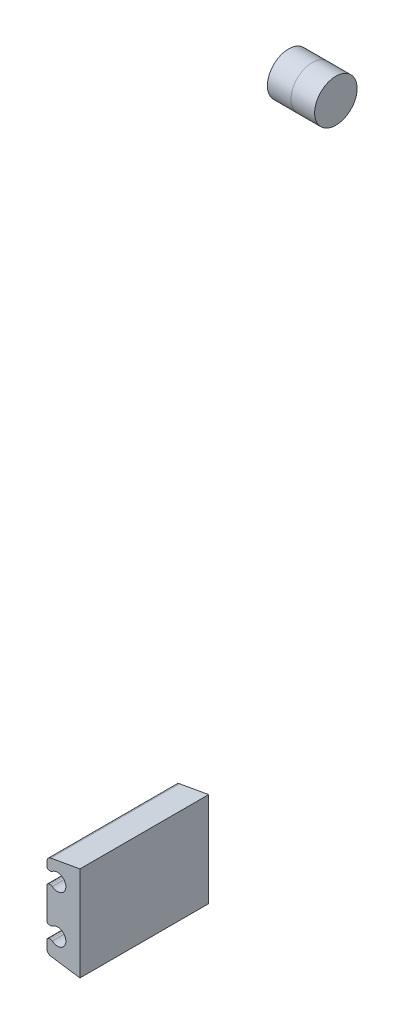
ISO-10303-21;
HEADER;
FILE_DESCRIPTION(('STEP AP214'),'2;1');
FILE_NAME('part.step','',(''),(''),'','','');
FILE_SCHEMA(('AUTOMOTIVE_DESIGN { 1 0 10303 214 1 1 1 1 }'));
ENDSEC;
DATA;
#1=APPLICATION_CONTEXT('core data for automotive mechanical design processes');
#2=APPLICATION_PROTOCOL_DEFINITION('international standard','automotive_design',2000,#1);
#3=PRODUCT_CONTEXT('',#1,'mechanical');
#4=PRODUCT('Part','Part','',(#3));
#5=PRODUCT_RELATED_PRODUCT_CATEGORY('part','',(#4));
#6=PRODUCT_DEFINITION_FORMATION('','',#4);
#7=PRODUCT_DEFINITION_CONTEXT('part definition',#1,'design');
#8=PRODUCT_DEFINITION('design','',#6,#7);
#9=PRODUCT_DEFINITION_SHAPE('','',#8);
#10=(LENGTH_UNIT() NAMED_UNIT(*) SI_UNIT(.MILLI.,.METRE.));
#11=(NAMED_UNIT(*) PLANE_ANGLE_UNIT() SI_UNIT($,.RADIAN.));
#12=(NAMED_UNIT(*) SI_UNIT($,.STERADIAN.) SOLID_ANGLE_UNIT());
#13=UNCERTAINTY_MEASURE_WITH_UNIT(LENGTH_MEASURE(1.E-05),#10,'distance_accuracy_value','');
#14=(GEOMETRIC_REPRESENTATION_CONTEXT(3) GLOBAL_UNCERTAINTY_ASSIGNED_CONTEXT((#13)) GLOBAL_UNIT_ASSIGNED_CONTEXT((#10,
#11,#12)) REPRESENTATION_CONTEXT('',''));
#15=CARTESIAN_POINT('',(0.,0.,0.));
#16=DIRECTION('',(0.,0.,1.));
#17=DIRECTION('',(1.,0.,0.));
#18=AXIS2_PLACEMENT_3D('',#15,#16,#17);
#19=CARTESIAN_POINT('',(29.25,13.,-16.65));
#20=DIRECTION('',(1.,0.,0.));
#21=DIRECTION('',(0.,0.,-1.));
#22=AXIS2_PLACEMENT_3D('',#19,#20,#21);
#23=PLANE('',#22);
#24=CARTESIAN_POINT('',(29.25,13.,-16.65));
#25=DIRECTION('',(1.,0.,0.));
#26=DIRECTION('',(0.,0.,-1.));
#27=AXIS2_PLACEMENT_3D('',#24,#25,#26);
#28=CIRCLE('',#27,4.5);
#29=CARTESIAN_POINT('',(29.25,13.,-21.15));
#30=VERTEX_POINT('',#29);
#31=EDGE_CURVE('E11',#30,#30,#28,.T.);
#32=ORIENTED_EDGE('',*,*,#31,.T.);
#33=EDGE_LOOP('',(#32));
#34=FACE_BOUND('',#33,.T.);
#35=CARTESIAN_POINT('',(29.25,13.,-16.65));
#36=DIRECTION('',(1.,0.,0.));
#37=DIRECTION('',(0.,0.,-1.));
#38=AXIS2_PLACEMENT_3D('',#35,#36,#37);
#39=CIRCLE('',#38,4.);
#40=CARTESIAN_POINT('',(29.25,13.,-20.65));
#41=VERTEX_POINT('',#40);
#42=EDGE_CURVE('E55',#41,#41,#39,.T.);
#43=ORIENTED_EDGE('',*,*,#42,.F.);
#44=EDGE_LOOP('',(#43));
#45=FACE_BOUND('',#44,.T.);
#46=ADVANCED_FACE('F44',(#34,#45),#23,.T.);
#47=CARTESIAN_POINT('',(24.25,13.,-16.65));
#48=DIRECTION('',(1.,0.,0.));
#49=DIRECTION('',(0.,0.,-1.));
#50=AXIS2_PLACEMENT_3D('',#47,#48,#49);
#51=PLANE('',#50);
#52=CARTESIAN_POINT('',(24.25,13.,-16.65));
#53=DIRECTION('',(1.,0.,0.));
#54=DIRECTION('',(0.,0.,-1.));
#55=AXIS2_PLACEMENT_3D('',#52,#53,#54);
#56=CIRCLE('',#55,4.5);
#57=CARTESIAN_POINT('',(24.25,13.,-21.15));
#58=VERTEX_POINT('',#57);
#59=EDGE_CURVE('E48',#58,#58,#56,.T.);
#60=ORIENTED_EDGE('',*,*,#59,.F.);
#61=EDGE_LOOP('',(#60));
#62=FACE_BOUND('',#61,.T.);
#63=CARTESIAN_POINT('',(24.25,13.,-16.65));
#64=DIRECTION('',(1.,0.,0.));
#65=DIRECTION('',(0.,0.,-1.));
#66=AXIS2_PLACEMENT_3D('',#63,#64,#65);
#67=CIRCLE('',#66,4.);
#68=CARTESIAN_POINT('',(24.25,13.,-20.65));
#69=VERTEX_POINT('',#68);
#70=EDGE_CURVE('E57',#69,#69,#67,.T.);
#71=ORIENTED_EDGE('',*,*,#70,.T.);
#72=EDGE_LOOP('',(#71));
#73=FACE_BOUND('',#72,.T.);
#74=ADVANCED_FACE('F67',(#62,#73),#51,.F.);
#75=CARTESIAN_POINT('',(29.25,13.,-16.65));
#76=DIRECTION('',(-1.,0.,0.));
#77=DIRECTION('',(0.,0.,1.));
#78=AXIS2_PLACEMENT_3D('',#75,#76,#77);
#79=CYLINDRICAL_SURFACE('',#78,4.5);
#80=ORIENTED_EDGE('',*,*,#31,.F.);
#81=EDGE_LOOP('',(#80));
#82=FACE_BOUND('',#81,.T.);
#83=ORIENTED_EDGE('',*,*,#59,.T.);
#84=EDGE_LOOP('',(#83));
#85=FACE_BOUND('',#84,.T.);
#86=ADVANCED_FACE('F46',(#82,#85),#79,.T.);
#87=CARTESIAN_POINT('',(29.25,13.,-16.65));
#88=DIRECTION('',(-1.,0.,0.));
#89=DIRECTION('',(0.,0.,1.));
#90=AXIS2_PLACEMENT_3D('',#87,#88,#89);
#91=CYLINDRICAL_SURFACE('',#90,4.);
#92=ORIENTED_EDGE('',*,*,#42,.T.);
#93=EDGE_LOOP('',(#92));
#94=FACE_BOUND('',#93,.T.);
#95=ORIENTED_EDGE('',*,*,#70,.F.);
#96=EDGE_LOOP('',(#95));
#97=FACE_BOUND('',#96,.T.);
#98=ADVANCED_FACE('F63',(#94,#97),#91,.F.);
#99=CLOSED_SHELL('',(#46,#74,#86,#98));
#100=MANIFOLD_SOLID_BREP('B2',#99);
#101=CARTESIAN_POINT('',(34.25,13.,-16.65));
#102=DIRECTION('',(-1.,0.,0.));
#103=DIRECTION('',(0.,0.,1.));
#104=AXIS2_PLACEMENT_3D('',#101,#102,#103);
#105=CYLINDRICAL_SURFACE('',#104,4.5);
#106=CARTESIAN_POINT('',(34.25,13.,-16.65));
#107=DIRECTION('',(1.,0.,0.));
#108=DIRECTION('',(0.,0.,-1.));
#109=AXIS2_PLACEMENT_3D('',#106,#107,#108);
#110=CIRCLE('',#109,4.5);
#111=CARTESIAN_POINT('',(34.25,13.,-21.15));
#112=VERTEX_POINT('',#111);
#113=EDGE_CURVE('E43',#112,#112,#110,.T.);
#114=ORIENTED_EDGE('',*,*,#113,.F.);
#115=EDGE_LOOP('',(#114));
#116=FACE_BOUND('',#115,.T.);
#117=CARTESIAN_POINT('',(24.25,13.,-16.65));
#118=DIRECTION('',(1.,0.,0.));
#119=DIRECTION('',(0.,0.,-1.));
#120=AXIS2_PLACEMENT_3D('',#117,#118,#119);
#121=CIRCLE('',#120,4.5);
#122=CARTESIAN_POINT('',(24.25,13.,-21.15));
#123=VERTEX_POINT('',#122);
#124=EDGE_CURVE('E118',#123,#123,#121,.T.);
#125=ORIENTED_EDGE('',*,*,#124,.T.);
#126=EDGE_LOOP('',(#125));
#127=FACE_BOUND('',#126,.T.);
#128=ADVANCED_FACE('F115',(#116,#127),#105,.T.);
#129=CARTESIAN_POINT('',(34.25,0.,0.));
#130=DIRECTION('',(1.,0.,0.));
#131=DIRECTION('',(0.,0.,-1.));
#132=AXIS2_PLACEMENT_3D('',#129,#130,#131);
#133=PLANE('',#132);
#134=ORIENTED_EDGE('',*,*,#113,.T.);
#135=EDGE_LOOP('',(#134));
#136=FACE_BOUND('',#135,.T.);
#137=ADVANCED_FACE('F130',(#136),#133,.T.);
#138=CARTESIAN_POINT('',(24.25,0.,0.));
#139=DIRECTION('',(1.,0.,0.));
#140=DIRECTION('',(0.,0.,-1.));
#141=AXIS2_PLACEMENT_3D('',#138,#139,#140);
#142=PLANE('',#141);
#143=ORIENTED_EDGE('',*,*,#124,.F.);
#144=EDGE_LOOP('',(#143));
#145=FACE_BOUND('',#144,.T.);
#146=ADVANCED_FACE('F128',(#145),#142,.F.);
#147=CLOSED_SHELL('',(#128,#137,#146));
#148=MANIFOLD_SOLID_BREP('B6',#147);
#149=CARTESIAN_POINT('',(-18.187147434952,-160.00801286414,-57.1617087304915));
#150=DIRECTION('',(0.,0.,1.));
#151=DIRECTION('',(0.,-1.,0.));
#152=AXIS2_PLACEMENT_3D('',#149,#150,#151);
#153=CYLINDRICAL_SURFACE('',#152,0.5);
#154=CARTESIAN_POINT('',(-18.187147434952,-160.00801286414,-35.9720886300508));
#155=DIRECTION('',(0.,0.,-1.));
#156=DIRECTION('',(0.,1.,0.));
#157=AXIS2_PLACEMENT_3D('',#154,#155,#156);
#158=CIRCLE('',#157,0.5);
#159=CARTESIAN_POINT('',(-17.8691445081905,-160.393854980259,-35.9720886300508));
#160=VERTEX_POINT('',#159);
#161=CARTESIAN_POINT('',(-18.18714743495,-160.50801286414,-35.9720886300508));
#162=VERTEX_POINT('',#161);
#163=EDGE_CURVE('E381',#160,#162,#158,.T.);
#164=ORIENTED_EDGE('',*,*,#163,.F.);
#165=DIRECTION('',(0.,0.,1.));
#166=VECTOR('',#165,1.);
#167=CARTESIAN_POINT('',(-17.8691445081905,-160.393854980259,-57.1617087304915));
#168=LINE('',#167,#166);
#169=CARTESIAN_POINT('',(-17.8691445081905,-160.393854980259,-8.72208863005055));
#170=VERTEX_POINT('',#169);
#171=EDGE_CURVE('E160',#160,#170,#168,.T.);
#172=ORIENTED_EDGE('',*,*,#171,.T.);
#173=CARTESIAN_POINT('',(-18.187147434952,-160.00801286414,-8.72208863005055));
#174=DIRECTION('',(0.,0.,-1.));
#175=DIRECTION('',(-1.,0.,0.));
#176=AXIS2_PLACEMENT_3D('',#173,#174,#175);
#177=CIRCLE('',#176,0.5);
#178=CARTESIAN_POINT('',(-18.18714743495,-160.50801286414,-8.72208863005055));
#179=VERTEX_POINT('',#178);
#180=EDGE_CURVE('E389',#170,#179,#177,.T.);
#181=ORIENTED_EDGE('',*,*,#180,.T.);
#182=DIRECTION('',(0.,0.,1.));
#183=VECTOR('',#182,1.);
#184=CARTESIAN_POINT('',(-18.18714743495,-160.50801286414,-57.1617087304915));
#185=LINE('',#184,#183);
#186=EDGE_CURVE('E267',#162,#179,#185,.T.);
#187=ORIENTED_EDGE('',*,*,#186,.F.);
#188=EDGE_LOOP('',(#164,#172,#181,#187));
#189=FACE_BOUND('',#188,.T.);
#190=ADVANCED_FACE('F156',(#189),#153,.T.);
#191=CARTESIAN_POINT('',(6.39499121123568E-10,-160.508012864067,-57.1617087304915));
#192=DIRECTION('',(-3.98429900183572E-12,1.,0.));
#193=DIRECTION('',(-1.,-3.98429900183572E-12,0.));
#194=AXIS2_PLACEMENT_3D('',#191,#192,#193);
#195=PLANE('',#194);
#196=DIRECTION('',(-1.,-3.98429900183572E-12,0.));
#197=VECTOR('',#196,1.);
#198=CARTESIAN_POINT('',(6.39499194639831E-10,-160.508012864067,-35.9720886300508));
#199=LINE('',#198,#197);
#200=CARTESIAN_POINT('',(-18.4948343784445,-160.508012864141,-35.9720886300508));
#201=VERTEX_POINT('',#200);
#202=EDGE_CURVE('E274',#162,#201,#199,.T.);
#203=ORIENTED_EDGE('',*,*,#202,.F.);
#204=ORIENTED_EDGE('',*,*,#186,.T.);
#205=DIRECTION('',(-1.,-3.98429900183572E-12,0.));
#206=VECTOR('',#205,1.);
#207=CARTESIAN_POINT('',(6.39511915440938E-10,-160.508012864067,-8.72208863005055));
#208=LINE('',#207,#206);
#209=CARTESIAN_POINT('',(-18.4948343784445,-160.508012864141,-8.72208863005055));
#210=VERTEX_POINT('',#209);
#211=EDGE_CURVE('E388',#179,#210,#208,.T.);
#212=ORIENTED_EDGE('',*,*,#211,.T.);
#213=DIRECTION('',(0.,0.,1.));
#214=VECTOR('',#213,1.);
#215=CARTESIAN_POINT('',(-18.4948343784445,-160.508012864141,-57.1617087304915));
#216=LINE('',#215,#214);
#217=EDGE_CURVE('E390',#201,#210,#216,.T.);
#218=ORIENTED_EDGE('',*,*,#217,.F.);
#219=EDGE_LOOP('',(#203,#204,#212,#218));
#220=FACE_BOUND('',#219,.T.);
#221=ADVANCED_FACE('F489',(#220),#195,.F.);
#222=CARTESIAN_POINT('',(-18.4948343784465,-160.008012864141,-57.1617087304915));
#223=DIRECTION('',(0.,0.,1.));
#224=DIRECTION('',(0.,-1.,0.));
#225=AXIS2_PLACEMENT_3D('',#222,#223,#224);
#226=CYLINDRICAL_SURFACE('',#225,0.5);
#227=CARTESIAN_POINT('',(-18.4948343784465,-160.008012864141,-35.9720886300508));
#228=DIRECTION('',(0.,0.,-1.));
#229=DIRECTION('',(0.,1.,0.));
#230=AXIS2_PLACEMENT_3D('',#227,#228,#229);
#231=CIRCLE('',#230,0.5);
#232=CARTESIAN_POINT('',(-18.9948343784465,-160.008012864143,-35.9720886300508));
#233=VERTEX_POINT('',#232);
#234=EDGE_CURVE('E377',#201,#233,#231,.T.);
#235=ORIENTED_EDGE('',*,*,#234,.F.);
#236=ORIENTED_EDGE('',*,*,#217,.T.);
#237=CARTESIAN_POINT('',(-18.4948343784464,-160.008012864141,-8.72208863005055));
#238=DIRECTION('',(0.,0.,-1.));
#239=DIRECTION('',(-1.,0.,0.));
#240=AXIS2_PLACEMENT_3D('',#237,#238,#239);
#241=CIRCLE('',#240,0.5);
#242=CARTESIAN_POINT('',(-18.9948343784464,-160.008012864143,-8.72208863005055));
#243=VERTEX_POINT('',#242);
#244=EDGE_CURVE('E392',#210,#243,#241,.T.);
#245=ORIENTED_EDGE('',*,*,#244,.T.);
#246=DIRECTION('',(0.,0.,1.));
#247=VECTOR('',#246,1.);
#248=CARTESIAN_POINT('',(-18.9948343784465,-160.008012864143,-57.1617087304915));
#249=LINE('',#248,#247);
#250=EDGE_CURVE('E393',#233,#243,#249,.T.);
#251=ORIENTED_EDGE('',*,*,#250,.F.);
#252=EDGE_LOOP('',(#235,#236,#245,#251));
#253=FACE_BOUND('',#252,.T.);
#254=ADVANCED_FACE('F492',(#253),#226,.T.);
#255=CARTESIAN_POINT('',(-18.9948343790841,-7.5634073613478E-11,-57.1617087304915));
#256=DIRECTION('',(1.,3.98516636357371E-12,0.));
#257=DIRECTION('',(-3.98516636357371E-12,1.,0.));
#258=AXIS2_PLACEMENT_3D('',#255,#256,#257);
#259=PLANE('',#258);
#260=DIRECTION('',(-3.98516636357371E-12,1.,0.));
#261=VECTOR('',#260,1.);
#262=CARTESIAN_POINT('',(-18.9948343790841,-7.56328973532719E-11,-35.9720886300508));
#263=LINE('',#262,#261);
#264=CARTESIAN_POINT('',(-18.9948343784724,-153.508012864141,-35.9720886300508));
#265=VERTEX_POINT('',#264);
#266=EDGE_CURVE('E374',#233,#265,#263,.T.);
#267=ORIENTED_EDGE('',*,*,#266,.F.);
#268=ORIENTED_EDGE('',*,*,#250,.T.);
#269=DIRECTION('',(-3.98516636357371E-12,1.,0.));
#270=VECTOR('',#269,1.);
#271=CARTESIAN_POINT('',(-18.9948343790841,-7.56975750491796E-11,-8.72208863005055));
#272=LINE('',#271,#270);
#273=CARTESIAN_POINT('',(-18.9948343784724,-153.508012864141,-8.72208863005055));
#274=VERTEX_POINT('',#273);
#275=EDGE_CURVE('E395',#243,#274,#272,.T.);
#276=ORIENTED_EDGE('',*,*,#275,.T.);
#277=DIRECTION('',(0.,0.,1.));
#278=VECTOR('',#277,1.);
#279=CARTESIAN_POINT('',(-18.9948343784724,-153.508012864141,-57.1617087304915));
#280=LINE('',#279,#278);
#281=EDGE_CURVE('E396',#265,#274,#280,.T.);
#282=ORIENTED_EDGE('',*,*,#281,.F.);
#283=EDGE_LOOP('',(#267,#268,#276,#282));
#284=FACE_BOUND('',#283,.T.);
#285=ADVANCED_FACE('F494',(#284),#259,.F.);
#286=CARTESIAN_POINT('',(-18.4948343784724,-153.508012864141,-57.1617087304915));
#287=DIRECTION('',(0.,0.,1.));
#288=DIRECTION('',(0.,-1.,0.));
#289=AXIS2_PLACEMENT_3D('',#286,#287,#288);
#290=CYLINDRICAL_SURFACE('',#289,0.5);
#291=CARTESIAN_POINT('',(-18.4948343784724,-153.508012864141,-35.9720886300508));
#292=DIRECTION('',(0.,0.,-1.));
#293=DIRECTION('',(0.,1.,0.));
#294=AXIS2_PLACEMENT_3D('',#291,#292,#293);
#295=CIRCLE('',#294,0.5);
#296=CARTESIAN_POINT('',(-18.4948343784744,-153.008012864141,-35.9720886300508));
#297=VERTEX_POINT('',#296);
#298=EDGE_CURVE('E371',#265,#297,#295,.T.);
#299=ORIENTED_EDGE('',*,*,#298,.F.);
#300=ORIENTED_EDGE('',*,*,#281,.T.);
#301=CARTESIAN_POINT('',(-18.4948343784724,-153.508012864141,-8.72208863005055));
#302=DIRECTION('',(0.,0.,-1.));
#303=DIRECTION('',(-1.,0.,0.));
#304=AXIS2_PLACEMENT_3D('',#301,#302,#303);
#305=CIRCLE('',#304,0.5);
#306=CARTESIAN_POINT('',(-18.4948343784743,-153.008012864141,-8.72208863005055));
#307=VERTEX_POINT('',#306);
#308=EDGE_CURVE('E398',#274,#307,#305,.T.);
#309=ORIENTED_EDGE('',*,*,#308,.T.);
#310=DIRECTION('',(0.,0.,1.));
#311=VECTOR('',#310,1.);
#312=CARTESIAN_POINT('',(-18.4948343784744,-153.008012864141,-57.1617087304915));
#313=LINE('',#312,#311);
#314=EDGE_CURVE('E399',#297,#307,#313,.T.);
#315=ORIENTED_EDGE('',*,*,#314,.F.);
#316=EDGE_LOOP('',(#299,#300,#309,#315));
#317=FACE_BOUND('',#316,.T.);
#318=ADVANCED_FACE('F498',(#317),#290,.T.);
#319=CARTESIAN_POINT('',(6.09882305201728E-10,-153.008012864067,-57.1617087304915));
#320=DIRECTION('',(3.9860337253117E-12,-1.,0.));
#321=DIRECTION('',(1.,3.9860337253117E-12,0.));
#322=AXIS2_PLACEMENT_3D('',#319,#320,#321);
#323=PLANE('',#322);
#324=DIRECTION('',(1.,3.9860337253117E-12,0.));
#325=VECTOR('',#324,1.);
#326=CARTESIAN_POINT('',(6.09882378717991E-10,-153.008012864067,-35.9720886300508));
#327=LINE('',#326,#325);
#328=CARTESIAN_POINT('',(-18.1871474349799,-153.00801286414,-35.9720886300508));
#329=VERTEX_POINT('',#328);
#330=EDGE_CURVE('E368',#297,#329,#327,.T.);
#331=ORIENTED_EDGE('',*,*,#330,.F.);
#332=ORIENTED_EDGE('',*,*,#314,.T.);
#333=DIRECTION('',(1.,3.9860337253117E-12,0.));
#334=VECTOR('',#333,1.);
#335=CARTESIAN_POINT('',(6.09895099519098E-10,-153.008012864067,-8.72208863005055));
#336=LINE('',#335,#334);
#337=CARTESIAN_POINT('',(-18.1871474349799,-153.00801286414,-8.72208863005055));
#338=VERTEX_POINT('',#337);
#339=EDGE_CURVE('E401',#307,#338,#336,.T.);
#340=ORIENTED_EDGE('',*,*,#339,.T.);
#341=DIRECTION('',(0.,0.,1.));
#342=VECTOR('',#341,1.);
#343=CARTESIAN_POINT('',(-18.1871474349799,-153.00801286414,-57.1617087304915));
#344=LINE('',#343,#342);
#345=EDGE_CURVE('E402',#329,#338,#344,.T.);
#346=ORIENTED_EDGE('',*,*,#345,.F.);
#347=EDGE_LOOP('',(#331,#332,#340,#346));
#348=FACE_BOUND('',#347,.T.);
#349=ADVANCED_FACE('F503',(#348),#323,.F.);
#350=CARTESIAN_POINT('',(-18.1871474349779,-153.50801286414,-57.1617087304915));
#351=DIRECTION('',(0.,0.,1.));
#352=DIRECTION('',(0.,-1.,0.));
#353=AXIS2_PLACEMENT_3D('',#350,#351,#352);
#354=CYLINDRICAL_SURFACE('',#353,0.5);
#355=CARTESIAN_POINT('',(-18.1871474349779,-153.50801286414,-35.9720886300508));
#356=DIRECTION('',(0.,0.,-1.));
#357=DIRECTION('',(0.,1.,0.));
#358=AXIS2_PLACEMENT_3D('',#355,#356,#357);
#359=CIRCLE('',#358,0.5);
#360=CARTESIAN_POINT('',(-17.8691445082195,-153.122170748018,-35.9720886300508));
#361=VERTEX_POINT('',#360);
#362=EDGE_CURVE('E365',#329,#361,#359,.T.);
#363=ORIENTED_EDGE('',*,*,#362,.F.);
#364=ORIENTED_EDGE('',*,*,#345,.T.);
#365=CARTESIAN_POINT('',(-18.1871474349779,-153.50801286414,-8.72208863005055));
#366=DIRECTION('',(0.,0.,-1.));
#367=DIRECTION('',(-1.,0.,0.));
#368=AXIS2_PLACEMENT_3D('',#365,#366,#367);
#369=CIRCLE('',#368,0.5);
#370=CARTESIAN_POINT('',(-17.8691445082195,-153.122170748018,-8.72208863005055));
#371=VERTEX_POINT('',#370);
#372=EDGE_CURVE('E404',#338,#371,#369,.T.);
#373=ORIENTED_EDGE('',*,*,#372,.T.);
#374=DIRECTION('',(0.,0.,1.));
#375=VECTOR('',#374,1.);
#376=CARTESIAN_POINT('',(-17.8691445082195,-153.122170748018,-57.1617087304915));
#377=LINE('',#376,#375);
#378=EDGE_CURVE('E405',#361,#371,#377,.T.);
#379=ORIENTED_EDGE('',*,*,#378,.F.);
#380=EDGE_LOOP('',(#363,#364,#373,#379));
#381=FACE_BOUND('',#380,.T.);
#382=ADVANCED_FACE('F506',(#381),#354,.T.);
#383=CARTESIAN_POINT('',(-16.7448343784793,-151.758012864134,-57.1617087304915));
#384=DIRECTION('',(0.,0.,1.));
#385=DIRECTION('',(0.,-1.,0.));
#386=AXIS2_PLACEMENT_3D('',#383,#384,#385);
#387=CYLINDRICAL_SURFACE('',#386,1.76776695296637);
#388=CARTESIAN_POINT('',(-16.7448343784793,-151.758012864134,-35.9720886300508));
#389=DIRECTION('',(0.,0.,-1.));
#390=DIRECTION('',(0.,1.,0.));
#391=AXIS2_PLACEMENT_3D('',#388,#389,#390);
#392=CIRCLE('',#391,1.76776695296637);
#393=CARTESIAN_POINT('',(-17.8691445082304,-150.393854980259,-35.9720886300508));
#394=VERTEX_POINT('',#393);
#395=EDGE_CURVE('E362',#361,#394,#392,.F.);
#396=ORIENTED_EDGE('',*,*,#395,.F.);
#397=ORIENTED_EDGE('',*,*,#378,.T.);
#398=CARTESIAN_POINT('',(-16.7448343784793,-151.758012864134,-8.72208863005055));
#399=DIRECTION('',(0.,0.,-1.));
#400=DIRECTION('',(-1.,0.,0.));
#401=AXIS2_PLACEMENT_3D('',#398,#399,#400);
#402=CIRCLE('',#401,1.76776695296637);
#403=CARTESIAN_POINT('',(-17.8691445082304,-150.393854980259,-8.72208863005055));
#404=VERTEX_POINT('',#403);
#405=EDGE_CURVE('E407',#371,#404,#402,.F.);
#406=ORIENTED_EDGE('',*,*,#405,.T.);
#407=DIRECTION('',(0.,0.,1.));
#408=VECTOR('',#407,1.);
#409=CARTESIAN_POINT('',(-17.8691445082304,-150.393854980259,-57.1617087304915));
#410=LINE('',#409,#408);
#411=EDGE_CURVE('E408',#394,#404,#410,.T.);
#412=ORIENTED_EDGE('',*,*,#411,.F.);
#413=EDGE_LOOP('',(#396,#397,#406,#412));
#414=FACE_BOUND('',#413,.T.);
#415=ADVANCED_FACE('F510',(#414),#387,.F.);
#416=CARTESIAN_POINT('',(-18.1871474349919,-150.00801286414,-57.1617087304915));
#417=DIRECTION('',(0.,0.,1.));
#418=DIRECTION('',(0.,-1.,0.));
#419=AXIS2_PLACEMENT_3D('',#416,#417,#418);
#420=CYLINDRICAL_SURFACE('',#419,0.5);
#421=CARTESIAN_POINT('',(-18.1871474349918,-150.00801286414,-35.9720886300508));
#422=DIRECTION('',(0.,0.,-1.));
#423=DIRECTION('',(0.,1.,0.));
#424=AXIS2_PLACEMENT_3D('',#421,#422,#423);
#425=CIRCLE('',#424,0.5);
#426=CARTESIAN_POINT('',(-18.1871474349899,-150.50801286414,-35.9720886300508));
#427=VERTEX_POINT('',#426);
#428=EDGE_CURVE('E359',#394,#427,#425,.T.);
#429=ORIENTED_EDGE('',*,*,#428,.F.);
#430=ORIENTED_EDGE('',*,*,#411,.T.);
#431=CARTESIAN_POINT('',(-18.1871474349918,-150.00801286414,-8.72208863005055));
#432=DIRECTION('',(0.,0.,-1.));
#433=DIRECTION('',(-1.,0.,0.));
#434=AXIS2_PLACEMENT_3D('',#431,#432,#433);
#435=CIRCLE('',#434,0.5);
#436=CARTESIAN_POINT('',(-18.1871474349898,-150.50801286414,-8.72208863005055));
#437=VERTEX_POINT('',#436);
#438=EDGE_CURVE('E410',#404,#437,#435,.T.);
#439=ORIENTED_EDGE('',*,*,#438,.T.);
#440=DIRECTION('',(0.,0.,1.));
#441=VECTOR('',#440,1.);
#442=CARTESIAN_POINT('',(-18.1871474349899,-150.50801286414,-57.1617087304915));
#443=LINE('',#442,#441);
#444=EDGE_CURVE('E411',#427,#437,#443,.T.);
#445=ORIENTED_EDGE('',*,*,#444,.F.);
#446=EDGE_LOOP('',(#429,#430,#439,#445));
#447=FACE_BOUND('',#446,.T.);
#448=ADVANCED_FACE('F515',(#447),#420,.T.);
#449=CARTESIAN_POINT('',(5.9978667599683E-10,-150.508012864067,-57.1617087304915));
#450=DIRECTION('',(-3.98516636357371E-12,1.,0.));
#451=DIRECTION('',(-1.,-3.98516636357371E-12,0.));
#452=AXIS2_PLACEMENT_3D('',#449,#450,#451);
#453=PLANE('',#452);
#454=DIRECTION('',(-1.,-3.98516636357371E-12,0.));
#455=VECTOR('',#454,1.);
#456=CARTESIAN_POINT('',(5.99786749513093E-10,-150.508012864067,-35.9720886300508));
#457=LINE('',#456,#455);
#458=CARTESIAN_POINT('',(-18.4948343784843,-150.508012864141,-35.9720886300508));
#459=VERTEX_POINT('',#458);
#460=EDGE_CURVE('E356',#427,#459,#457,.T.);
#461=ORIENTED_EDGE('',*,*,#460,.F.);
#462=ORIENTED_EDGE('',*,*,#444,.T.);
#463=DIRECTION('',(-1.,-3.98516636357371E-12,0.));
#464=VECTOR('',#463,1.);
#465=CARTESIAN_POINT('',(5.997994703142E-10,-150.508012864067,-8.72208863005055));
#466=LINE('',#465,#464);
#467=CARTESIAN_POINT('',(-18.4948343784843,-150.508012864141,-8.72208863005055));
#468=VERTEX_POINT('',#467);
#469=EDGE_CURVE('E413',#437,#468,#466,.T.);
#470=ORIENTED_EDGE('',*,*,#469,.T.);
#471=DIRECTION('',(0.,0.,1.));
#472=VECTOR('',#471,1.);
#473=CARTESIAN_POINT('',(-18.4948343784843,-150.508012864141,-57.1617087304915));
#474=LINE('',#473,#472);
#475=EDGE_CURVE('E414',#459,#468,#474,.T.);
#476=ORIENTED_EDGE('',*,*,#475,.F.);
#477=EDGE_LOOP('',(#461,#462,#470,#476));
#478=FACE_BOUND('',#477,.T.);
#479=ADVANCED_FACE('F518',(#478),#453,.F.);
#480=CARTESIAN_POINT('',(-18.4948343784863,-150.008012864141,-57.1617087304915));
#481=DIRECTION('',(0.,0.,1.));
#482=DIRECTION('',(0.,-1.,0.));
#483=AXIS2_PLACEMENT_3D('',#480,#481,#482);
#484=CYLINDRICAL_SURFACE('',#483,0.5);
#485=CARTESIAN_POINT('',(-18.4948343784863,-150.008012864141,-35.9720886300508));
#486=DIRECTION('',(0.,0.,-1.));
#487=DIRECTION('',(0.,1.,0.));
#488=AXIS2_PLACEMENT_3D('',#485,#486,#487);
#489=CIRCLE('',#488,0.5);
#490=CARTESIAN_POINT('',(-18.9948343784863,-150.008012864143,-35.9720886300508));
#491=VERTEX_POINT('',#490);
#492=EDGE_CURVE('E353',#459,#491,#489,.T.);
#493=ORIENTED_EDGE('',*,*,#492,.F.);
#494=ORIENTED_EDGE('',*,*,#475,.T.);
#495=CARTESIAN_POINT('',(-18.4948343784863,-150.008012864141,-8.72208863005055));
#496=DIRECTION('',(0.,0.,-1.));
#497=DIRECTION('',(-1.,0.,0.));
#498=AXIS2_PLACEMENT_3D('',#495,#496,#497);
#499=CIRCLE('',#498,0.5);
#500=CARTESIAN_POINT('',(-18.9948343784863,-150.008012864143,-8.72208863005055));
#501=VERTEX_POINT('',#500);
#502=EDGE_CURVE('E416',#468,#501,#499,.T.);
#503=ORIENTED_EDGE('',*,*,#502,.T.);
#504=DIRECTION('',(0.,0.,1.));
#505=VECTOR('',#504,1.);
#506=CARTESIAN_POINT('',(-18.9948343784863,-150.008012864143,-57.1617087304915));
#507=LINE('',#506,#505);
#508=EDGE_CURVE('E417',#491,#501,#507,.T.);
#509=ORIENTED_EDGE('',*,*,#508,.F.);
#510=EDGE_LOOP('',(#493,#494,#503,#509));
#511=FACE_BOUND('',#510,.T.);
#512=ADVANCED_FACE('F522',(#511),#484,.T.);
#513=CARTESIAN_POINT('',(-18.9948343790841,-7.5634073613478E-11,-57.1617087304915));
#514=DIRECTION('',(1.,3.98516636357371E-12,0.));
#515=DIRECTION('',(-3.98516636357371E-12,1.,0.));
#516=AXIS2_PLACEMENT_3D('',#513,#514,#515);
#517=PLANE('',#516);
#518=DIRECTION('',(-3.98516636357371E-12,1.,0.));
#519=VECTOR('',#518,1.);
#520=CARTESIAN_POINT('',(-18.9948343790841,-7.56328973532719E-11,-35.9720886300508));
#521=LINE('',#520,#519);
#522=CARTESIAN_POINT('',(-18.99483437849,-149.073424011163,-35.9720886300508));
#523=VERTEX_POINT('',#522);
#524=EDGE_CURVE('E350',#491,#523,#521,.T.);
#525=ORIENTED_EDGE('',*,*,#524,.F.);
#526=ORIENTED_EDGE('',*,*,#508,.T.);
#527=DIRECTION('',(-3.98516636357371E-12,1.,0.));
#528=VECTOR('',#527,1.);
#529=CARTESIAN_POINT('',(-18.9948343790841,-7.56975750491796E-11,-8.72208863005055));
#530=LINE('',#529,#528);
#531=CARTESIAN_POINT('',(-18.99483437849,-149.073424011163,-8.72208863005055));
#532=VERTEX_POINT('',#531);
#533=EDGE_CURVE('E419',#501,#532,#530,.T.);
#534=ORIENTED_EDGE('',*,*,#533,.T.);
#535=DIRECTION('',(0.,0.,1.));
#536=VECTOR('',#535,1.);
#537=CARTESIAN_POINT('',(-18.99483437849,-149.073424011163,-57.1617087304915));
#538=LINE('',#537,#536);
#539=EDGE_CURVE('E420',#523,#532,#538,.T.);
#540=ORIENTED_EDGE('',*,*,#539,.F.);
#541=EDGE_LOOP('',(#525,#526,#534,#540));
#542=FACE_BOUND('',#541,.T.);
#543=ADVANCED_FACE('F527',(#542),#517,.F.);
#544=CARTESIAN_POINT('',(-17.99483437849,-149.073424011163,-57.1617087304915));
#545=DIRECTION('',(0.,0.,1.));
#546=DIRECTION('',(0.,-1.,0.));
#547=AXIS2_PLACEMENT_3D('',#544,#545,#546);
#548=CYLINDRICAL_SURFACE('',#547,1.);
#549=CARTESIAN_POINT('',(-17.99483437849,-149.073424011163,-35.9720886300508));
#550=DIRECTION('',(0.,0.,-1.));
#551=DIRECTION('',(0.,1.,0.));
#552=AXIS2_PLACEMENT_3D('',#549,#550,#551);
#553=CIRCLE('',#552,1.);
#554=CARTESIAN_POINT('',(-18.1706250169776,-148.088996435655,-35.9720886300508));
#555=VERTEX_POINT('',#554);
#556=EDGE_CURVE('E347',#523,#555,#553,.T.);
#557=ORIENTED_EDGE('',*,*,#556,.F.);
#558=ORIENTED_EDGE('',*,*,#539,.T.);
#559=CARTESIAN_POINT('',(-17.99483437849,-149.073424011163,-8.72208863005055));
#560=DIRECTION('',(0.,0.,-1.));
#561=DIRECTION('',(-1.,0.,0.));
#562=AXIS2_PLACEMENT_3D('',#559,#560,#561);
#563=CIRCLE('',#562,1.);
#564=CARTESIAN_POINT('',(-18.1706250169776,-148.088996435655,-8.72208863005055));
#565=VERTEX_POINT('',#564);
#566=EDGE_CURVE('E422',#532,#565,#563,.T.);
#567=ORIENTED_EDGE('',*,*,#566,.T.);
#568=DIRECTION('',(0.,0.,1.));
#569=VECTOR('',#568,1.);
#570=CARTESIAN_POINT('',(-18.1706250169776,-148.088996435655,-57.1617087304915));
#571=LINE('',#570,#569);
#572=EDGE_CURVE('E423',#555,#565,#571,.T.);
#573=ORIENTED_EDGE('',*,*,#572,.F.);
#574=EDGE_LOOP('',(#557,#558,#567,#573));
#575=FACE_BOUND('',#574,.T.);
#576=ADVANCED_FACE('F530',(#575),#548,.T.);
#577=CARTESIAN_POINT('',(25.0657526279294,-140.368214713172,-57.1617087304915));
#578=DIRECTION('',(0.175790638487581,-0.984427575507781,0.));
#579=DIRECTION('',(0.984427575507781,0.175790638487581,0.));
#580=AXIS2_PLACEMENT_3D('',#577,#578,#579);
#581=PLANE('',#580);
#582=DIRECTION('',(0.984427575507781,0.175790638487581,0.));
#583=VECTOR('',#582,1.);
#584=CARTESIAN_POINT('',(25.0657526279294,-140.368214713172,-35.9720886300508));
#585=LINE('',#584,#583);
#586=CARTESIAN_POINT('',(-11.9948343784983,-146.986176678758,-35.9720886300508));
#587=VERTEX_POINT('',#586);
#588=EDGE_CURVE('E344',#555,#587,#585,.T.);
#589=ORIENTED_EDGE('',*,*,#588,.F.);
#590=ORIENTED_EDGE('',*,*,#572,.T.);
#591=DIRECTION('',(0.984427575507781,0.175790638487581,0.));
#592=VECTOR('',#591,1.);
#593=CARTESIAN_POINT('',(25.0657526279294,-140.368214713172,-8.72208863005055));
#594=LINE('',#593,#592);
#595=CARTESIAN_POINT('',(-11.9948343784983,-146.986176678758,-8.72208863005055));
#596=VERTEX_POINT('',#595);
#597=EDGE_CURVE('E425',#565,#596,#594,.T.);
#598=ORIENTED_EDGE('',*,*,#597,.T.);
#599=DIRECTION('',(0.,0.,1.));
#600=VECTOR('',#599,1.);
#601=CARTESIAN_POINT('',(-11.9948343784984,-146.986176678758,-57.1617087304915));
#602=LINE('',#601,#600);
#603=EDGE_CURVE('E426',#587,#596,#602,.T.);
#604=ORIENTED_EDGE('',*,*,#603,.F.);
#605=EDGE_LOOP('',(#589,#590,#598,#604));
#606=FACE_BOUND('',#605,.T.);
#607=ADVANCED_FACE('F534',(#606),#581,.F.);
#608=CARTESIAN_POINT('',(-11.9948343790841,-4.7737909068462E-11,-57.1617087304915));
#609=DIRECTION('',(-1.,-3.98516636357371E-12,0.));
#610=DIRECTION('',(3.98516636357371E-12,-1.,0.));
#611=AXIS2_PLACEMENT_3D('',#608,#609,#610);
#612=PLANE('',#611);
#613=DIRECTION('',(3.98516636357371E-12,-1.,0.));
#614=VECTOR('',#613,1.);
#615=CARTESIAN_POINT('',(-11.9948343790841,-4.77367328082559E-11,-35.9720886300508));
#616=LINE('',#615,#614);
#617=CARTESIAN_POINT('',(-11.9948343784187,-166.986176678758,-35.9720886300508));
#618=VERTEX_POINT('',#617);
#619=EDGE_CURVE('E341',#587,#618,#616,.T.);
#620=ORIENTED_EDGE('',*,*,#619,.F.);
#621=ORIENTED_EDGE('',*,*,#603,.T.);
#622=DIRECTION('',(3.98516636357371E-12,-1.,0.));
#623=VECTOR('',#622,1.);
#624=CARTESIAN_POINT('',(-11.9948343790841,-4.78014105041636E-11,-8.72208863005055));
#625=LINE('',#624,#623);
#626=CARTESIAN_POINT('',(-11.9948343784186,-166.986176678758,-8.72208863005055));
#627=VERTEX_POINT('',#626);
#628=EDGE_CURVE('E428',#596,#627,#625,.T.);
#629=ORIENTED_EDGE('',*,*,#628,.T.);
#630=DIRECTION('',(0.,0.,1.));
#631=VECTOR('',#630,1.);
#632=CARTESIAN_POINT('',(-11.9948343784187,-166.986176678758,-57.1617087304915));
#633=LINE('',#632,#631);
#634=EDGE_CURVE('E429',#618,#627,#633,.T.);
#635=ORIENTED_EDGE('',*,*,#634,.F.);
#636=EDGE_LOOP('',(#620,#621,#629,#635));
#637=FACE_BOUND('',#636,.T.);
#638=ADVANCED_FACE('F539',(#637),#612,.F.);
#639=CARTESIAN_POINT('',(-24.1177448433012,-165.216515452399,-57.1617087304915));
#640=DIRECTION('',(0.144445701645839,0.98951272820315,0.));
#641=DIRECTION('',(-0.98951272820315,0.144445701645839,0.));
#642=AXIS2_PLACEMENT_3D('',#639,#640,#641);
#643=PLANE('',#642);
#644=DIRECTION('',(-0.98951272820315,0.144445701645839,0.));
#645=VECTOR('',#644,1.);
#646=CARTESIAN_POINT('',(-24.1177448433012,-165.216515452399,-35.9720886300508));
#647=LINE('',#646,#645);
#648=CARTESIAN_POINT('',(-18.139280080072,-166.089231399225,-35.9720886300508));
#649=VERTEX_POINT('',#648);
#650=EDGE_CURVE('E338',#618,#649,#647,.T.);
#651=ORIENTED_EDGE('',*,*,#650,.F.);
#652=ORIENTED_EDGE('',*,*,#634,.T.);
#653=DIRECTION('',(-0.98951272820315,0.144445701645839,0.));
#654=VECTOR('',#653,1.);
#655=CARTESIAN_POINT('',(-24.1177448433012,-165.216515452399,-8.72208863005055));
#656=LINE('',#655,#654);
#657=CARTESIAN_POINT('',(-18.139280080072,-166.089231399225,-8.72208863005055));
#658=VERTEX_POINT('',#657);
#659=EDGE_CURVE('E431',#627,#658,#656,.T.);
#660=ORIENTED_EDGE('',*,*,#659,.T.);
#661=DIRECTION('',(0.,0.,1.));
#662=VECTOR('',#661,1.);
#663=CARTESIAN_POINT('',(-18.139280080072,-166.089231399225,-57.1617087304915));
#664=LINE('',#663,#662);
#665=EDGE_CURVE('E432',#649,#658,#664,.T.);
#666=ORIENTED_EDGE('',*,*,#665,.F.);
#667=EDGE_LOOP('',(#651,#652,#660,#666));
#668=FACE_BOUND('',#667,.T.);
#669=ADVANCED_FACE('F542',(#668),#643,.F.);
#670=CARTESIAN_POINT('',(-17.9948343784262,-165.099718671022,-57.1617087304915));
#671=DIRECTION('',(0.,0.,1.));
#672=DIRECTION('',(0.,-1.,0.));
#673=AXIS2_PLACEMENT_3D('',#670,#671,#672);
#674=CYLINDRICAL_SURFACE('',#673,1.);
#675=CARTESIAN_POINT('',(-17.9948343784262,-165.099718671022,-35.9720886300508));
#676=DIRECTION('',(0.,0.,-1.));
#677=DIRECTION('',(0.,1.,0.));
#678=AXIS2_PLACEMENT_3D('',#675,#676,#677);
#679=CIRCLE('',#678,1.);
#680=CARTESIAN_POINT('',(-18.9948343784262,-165.099718671026,-35.9720886300508));
#681=VERTEX_POINT('',#680);
#682=EDGE_CURVE('E335',#649,#681,#679,.T.);
#683=ORIENTED_EDGE('',*,*,#682,.F.);
#684=ORIENTED_EDGE('',*,*,#665,.T.);
#685=CARTESIAN_POINT('',(-17.9948343784262,-165.099718671022,-8.72208863005055));
#686=DIRECTION('',(0.,0.,-1.));
#687=DIRECTION('',(-1.,0.,0.));
#688=AXIS2_PLACEMENT_3D('',#685,#686,#687);
#689=CIRCLE('',#688,1.);
#690=CARTESIAN_POINT('',(-18.9948343784262,-165.099718671026,-8.72208863005055));
#691=VERTEX_POINT('',#690);
#692=EDGE_CURVE('E434',#658,#691,#689,.T.);
#693=ORIENTED_EDGE('',*,*,#692,.T.);
#694=DIRECTION('',(0.,0.,1.));
#695=VECTOR('',#694,1.);
#696=CARTESIAN_POINT('',(-18.9948343784262,-165.099718671026,-57.1617087304915));
#697=LINE('',#696,#695);
#698=EDGE_CURVE('E435',#681,#691,#697,.T.);
#699=ORIENTED_EDGE('',*,*,#698,.F.);
#700=EDGE_LOOP('',(#683,#684,#693,#699));
#701=FACE_BOUND('',#700,.T.);
#702=ADVANCED_FACE('F546',(#701),#674,.T.);
#703=CARTESIAN_POINT('',(-18.9948343790841,-7.5634073613478E-11,-57.1617087304915));
#704=DIRECTION('',(1.,3.98516636357371E-12,0.));
#705=DIRECTION('',(-3.98516636357371E-12,1.,0.));
#706=AXIS2_PLACEMENT_3D('',#703,#704,#705);
#707=PLANE('',#706);
#708=DIRECTION('',(-3.98516636357371E-12,1.,0.));
#709=VECTOR('',#708,1.);
#710=CARTESIAN_POINT('',(-18.9948343790841,-7.56328973532719E-11,-35.9720886300508));
#711=LINE('',#710,#709);
#712=CARTESIAN_POINT('',(-18.9948343784325,-163.508012864141,-35.9720886300508));
#713=VERTEX_POINT('',#712);
#714=EDGE_CURVE('E330',#681,#713,#711,.T.);
#715=ORIENTED_EDGE('',*,*,#714,.F.);
#716=ORIENTED_EDGE('',*,*,#698,.T.);
#717=DIRECTION('',(-3.98516636357371E-12,1.,0.));
#718=VECTOR('',#717,1.);
#719=CARTESIAN_POINT('',(-18.9948343790841,-7.56975750491796E-11,-8.72208863005055));
#720=LINE('',#719,#718);
#721=CARTESIAN_POINT('',(-18.9948343784325,-163.508012864141,-8.72208863005055));
#722=VERTEX_POINT('',#721);
#723=EDGE_CURVE('E437',#691,#722,#720,.T.);
#724=ORIENTED_EDGE('',*,*,#723,.T.);
#725=DIRECTION('',(0.,0.,1.));
#726=VECTOR('',#725,1.);
#727=CARTESIAN_POINT('',(-18.9948343784325,-163.508012864141,-57.1617087304915));
#728=LINE('',#727,#726);
#729=EDGE_CURVE('E438',#713,#722,#728,.T.);
#730=ORIENTED_EDGE('',*,*,#729,.F.);
#731=EDGE_LOOP('',(#715,#716,#724,#730));
#732=FACE_BOUND('',#731,.T.);
#733=ADVANCED_FACE('F551',(#732),#707,.F.);
#734=CARTESIAN_POINT('',(-18.4948343784325,-163.508012864141,-57.1617087304915));
#735=DIRECTION('',(0.,0.,1.));
#736=DIRECTION('',(0.,-1.,0.));
#737=AXIS2_PLACEMENT_3D('',#734,#735,#736);
#738=CYLINDRICAL_SURFACE('',#737,0.5);
#739=CARTESIAN_POINT('',(-18.4948343784325,-163.508012864141,-35.9720886300508));
#740=DIRECTION('',(0.,0.,-1.));
#741=DIRECTION('',(0.,1.,0.));
#742=AXIS2_PLACEMENT_3D('',#739,#740,#741);
#743=CIRCLE('',#742,0.5);
#744=CARTESIAN_POINT('',(-18.4948343784345,-163.008012864141,-35.9720886300508));
#745=VERTEX_POINT('',#744);
#746=EDGE_CURVE('E328',#713,#745,#743,.T.);
#747=ORIENTED_EDGE('',*,*,#746,.F.);
#748=ORIENTED_EDGE('',*,*,#729,.T.);
#749=CARTESIAN_POINT('',(-18.4948343784325,-163.508012864141,-8.72208863005055));
#750=DIRECTION('',(0.,0.,-1.));
#751=DIRECTION('',(-1.,0.,0.));
#752=AXIS2_PLACEMENT_3D('',#749,#750,#751);
#753=CIRCLE('',#752,0.5);
#754=CARTESIAN_POINT('',(-18.4948343784345,-163.008012864141,-8.72208863005055));
#755=VERTEX_POINT('',#754);
#756=EDGE_CURVE('E440',#722,#755,#753,.T.);
#757=ORIENTED_EDGE('',*,*,#756,.T.);
#758=DIRECTION('',(0.,0.,1.));
#759=VECTOR('',#758,1.);
#760=CARTESIAN_POINT('',(-18.4948343784345,-163.008012864141,-57.1617087304915));
#761=LINE('',#760,#759);
#762=EDGE_CURVE('E441',#745,#755,#761,.T.);
#763=ORIENTED_EDGE('',*,*,#762,.F.);
#764=EDGE_LOOP('',(#747,#748,#757,#763));
#765=FACE_BOUND('',#764,.T.);
#766=ADVANCED_FACE('F554',(#765),#738,.T.);
#767=CARTESIAN_POINT('',(6.49601255541501E-10,-163.008012864067,-57.1617087304915));
#768=DIRECTION('',(3.98516636357371E-12,-1.,0.));
#769=DIRECTION('',(1.,3.98516636357371E-12,0.));
#770=AXIS2_PLACEMENT_3D('',#767,#768,#769);
#771=PLANE('',#770);
#772=DIRECTION('',(1.,3.98516636357371E-12,0.));
#773=VECTOR('',#772,1.);
#774=CARTESIAN_POINT('',(6.49601329057764E-10,-163.008012864067,-35.9720886300508));
#775=LINE('',#774,#773);
#776=CARTESIAN_POINT('',(-18.18714743494,-163.00801286414,-35.9720886300508));
#777=VERTEX_POINT('',#776);
#778=EDGE_CURVE('E165',#745,#777,#775,.T.);
#779=ORIENTED_EDGE('',*,*,#778,.F.);
#780=ORIENTED_EDGE('',*,*,#762,.T.);
#781=DIRECTION('',(1.,3.98516636357371E-12,0.));
#782=VECTOR('',#781,1.);
#783=CARTESIAN_POINT('',(6.49614049858872E-10,-163.008012864067,-8.72208863005055));
#784=LINE('',#783,#782);
#785=CARTESIAN_POINT('',(-18.18714743494,-163.00801286414,-8.72208863005055));
#786=VERTEX_POINT('',#785);
#787=EDGE_CURVE('E322',#755,#786,#784,.T.);
#788=ORIENTED_EDGE('',*,*,#787,.T.);
#789=DIRECTION('',(0.,0.,1.));
#790=VECTOR('',#789,1.);
#791=CARTESIAN_POINT('',(-18.18714743494,-163.00801286414,-57.1617087304915));
#792=LINE('',#791,#790);
#793=EDGE_CURVE('E313',#777,#786,#792,.T.);
#794=ORIENTED_EDGE('',*,*,#793,.F.);
#795=EDGE_LOOP('',(#779,#780,#788,#794));
#796=FACE_BOUND('',#795,.T.);
#797=ADVANCED_FACE('F319',(#796),#771,.F.);
#798=CARTESIAN_POINT('',(-18.1871474349381,-163.50801286414,-57.1617087304915));
#799=DIRECTION('',(0.,0.,1.));
#800=DIRECTION('',(0.,-1.,0.));
#801=AXIS2_PLACEMENT_3D('',#798,#799,#800);
#802=CYLINDRICAL_SURFACE('',#801,0.5);
#803=CARTESIAN_POINT('',(-18.187147434938,-163.50801286414,-35.9720886300508));
#804=DIRECTION('',(0.,0.,-1.));
#805=DIRECTION('',(0.,1.,0.));
#806=AXIS2_PLACEMENT_3D('',#803,#804,#805);
#807=CIRCLE('',#806,0.5);
#808=CARTESIAN_POINT('',(-17.8691445081797,-163.122170748018,-35.9720886300508));
#809=VERTEX_POINT('',#808);
#810=EDGE_CURVE('E113',#777,#809,#807,.T.);
#811=ORIENTED_EDGE('',*,*,#810,.F.);
#812=ORIENTED_EDGE('',*,*,#793,.T.);
#813=CARTESIAN_POINT('',(-18.187147434938,-163.50801286414,-8.72208863005055));
#814=DIRECTION('',(0.,0.,-1.));
#815=DIRECTION('',(-1.,0.,0.));
#816=AXIS2_PLACEMENT_3D('',#813,#814,#815);
#817=CIRCLE('',#816,0.5);
#818=CARTESIAN_POINT('',(-17.8691445081796,-163.122170748018,-8.72208863005055));
#819=VERTEX_POINT('',#818);
#820=EDGE_CURVE('E324',#786,#819,#817,.T.);
#821=ORIENTED_EDGE('',*,*,#820,.T.);
#822=DIRECTION('',(0.,0.,1.));
#823=VECTOR('',#822,1.);
#824=CARTESIAN_POINT('',(-17.8691445081797,-163.122170748018,-57.1617087304915));
#825=LINE('',#824,#823);
#826=EDGE_CURVE('E178',#809,#819,#825,.T.);
#827=ORIENTED_EDGE('',*,*,#826,.F.);
#828=EDGE_LOOP('',(#811,#812,#821,#827));
#829=FACE_BOUND('',#828,.T.);
#830=ADVANCED_FACE('F312',(#829),#802,.T.);
#831=CARTESIAN_POINT('',(-16.7448343784395,-161.758012864134,-57.1617087304915));
#832=DIRECTION('',(0.,0.,1.));
#833=DIRECTION('',(0.,-1.,0.));
#834=AXIS2_PLACEMENT_3D('',#831,#832,#833);
#835=CYLINDRICAL_SURFACE('',#834,1.76776695296637);
#836=CARTESIAN_POINT('',(-16.7448343784395,-161.758012864134,-35.9720886300508));
#837=DIRECTION('',(0.,0.,-1.));
#838=DIRECTION('',(0.,1.,0.));
#839=AXIS2_PLACEMENT_3D('',#836,#837,#838);
#840=CIRCLE('',#839,1.76776695296637);
#841=EDGE_CURVE('E384',#809,#160,#840,.F.);
#842=ORIENTED_EDGE('',*,*,#841,.F.);
#843=ORIENTED_EDGE('',*,*,#826,.T.);
#844=CARTESIAN_POINT('',(-16.7448343784395,-161.758012864134,-8.72208863005055));
#845=DIRECTION('',(0.,0.,-1.));
#846=DIRECTION('',(-1.,0.,0.));
#847=AXIS2_PLACEMENT_3D('',#844,#845,#846);
#848=CIRCLE('',#847,1.76776695296637);
#849=EDGE_CURVE('E386',#819,#170,#848,.F.);
#850=ORIENTED_EDGE('',*,*,#849,.T.);
#851=ORIENTED_EDGE('',*,*,#171,.F.);
#852=EDGE_LOOP('',(#842,#843,#850,#851));
#853=FACE_BOUND('',#852,.T.);
#854=ADVANCED_FACE('F484',(#853),#835,.F.);
#855=CARTESIAN_POINT('',(0.,0.,-8.72208863005055));
#856=DIRECTION('',(0.,0.,-1.));
#857=DIRECTION('',(-1.,0.,0.));
#858=AXIS2_PLACEMENT_3D('',#855,#856,#857);
#859=PLANE('',#858);
#860=ORIENTED_EDGE('',*,*,#180,.F.);
#861=ORIENTED_EDGE('',*,*,#849,.F.);
#862=ORIENTED_EDGE('',*,*,#820,.F.);
#863=ORIENTED_EDGE('',*,*,#787,.F.);
#864=ORIENTED_EDGE('',*,*,#756,.F.);
#865=ORIENTED_EDGE('',*,*,#723,.F.);
#866=ORIENTED_EDGE('',*,*,#692,.F.);
#867=ORIENTED_EDGE('',*,*,#659,.F.);
#868=ORIENTED_EDGE('',*,*,#628,.F.);
#869=ORIENTED_EDGE('',*,*,#597,.F.);
#870=ORIENTED_EDGE('',*,*,#566,.F.);
#871=ORIENTED_EDGE('',*,*,#533,.F.);
#872=ORIENTED_EDGE('',*,*,#502,.F.);
#873=ORIENTED_EDGE('',*,*,#469,.F.);
#874=ORIENTED_EDGE('',*,*,#438,.F.);
#875=ORIENTED_EDGE('',*,*,#405,.F.);
#876=ORIENTED_EDGE('',*,*,#372,.F.);
#877=ORIENTED_EDGE('',*,*,#339,.F.);
#878=ORIENTED_EDGE('',*,*,#308,.F.);
#879=ORIENTED_EDGE('',*,*,#275,.F.);
#880=ORIENTED_EDGE('',*,*,#244,.F.);
#881=ORIENTED_EDGE('',*,*,#211,.F.);
#882=EDGE_LOOP('',(#860,#861,#862,#863,#864,#865,#866,#867,#868,#869,#870,#871,#872,#873,#874,
#875,#876,#877,#878,#879,#880,#881));
#883=FACE_BOUND('',#882,.T.);
#884=ADVANCED_FACE('F486',(#883),#859,.F.);
#885=CARTESIAN_POINT('',(8.25516562164519,-182.986176678678,-35.9720886300508));
#886=DIRECTION('',(0.,0.,-1.));
#887=DIRECTION('',(-3.98689414815579E-12,1.,0.));
#888=AXIS2_PLACEMENT_3D('',#885,#886,#887);
#889=PLANE('',#888);
#890=ORIENTED_EDGE('',*,*,#841,.T.);
#891=ORIENTED_EDGE('',*,*,#163,.T.);
#892=ORIENTED_EDGE('',*,*,#202,.T.);
#893=ORIENTED_EDGE('',*,*,#234,.T.);
#894=ORIENTED_EDGE('',*,*,#266,.T.);
#895=ORIENTED_EDGE('',*,*,#298,.T.);
#896=ORIENTED_EDGE('',*,*,#330,.T.);
#897=ORIENTED_EDGE('',*,*,#362,.T.);
#898=ORIENTED_EDGE('',*,*,#395,.T.);
#899=ORIENTED_EDGE('',*,*,#428,.T.);
#900=ORIENTED_EDGE('',*,*,#460,.T.);
#901=ORIENTED_EDGE('',*,*,#492,.T.);
#902=ORIENTED_EDGE('',*,*,#524,.T.);
#903=ORIENTED_EDGE('',*,*,#556,.T.);
#904=ORIENTED_EDGE('',*,*,#588,.T.);
#905=ORIENTED_EDGE('',*,*,#619,.T.);
#906=ORIENTED_EDGE('',*,*,#650,.T.);
#907=ORIENTED_EDGE('',*,*,#682,.T.);
#908=ORIENTED_EDGE('',*,*,#714,.T.);
#909=ORIENTED_EDGE('',*,*,#746,.T.);
#910=ORIENTED_EDGE('',*,*,#778,.T.);
#911=ORIENTED_EDGE('',*,*,#810,.T.);
#912=EDGE_LOOP('',(#890,#891,#892,#893,#894,#895,#896,#897,#898,#899,#900,#901,#902,#903,#904,
#905,#906,#907,#908,#909,#910,#911));
#913=FACE_BOUND('',#912,.T.);
#914=ADVANCED_FACE('F158',(#913),#889,.T.);
#915=CLOSED_SHELL('',(#190,#221,#254,#285,#318,#349,#382,#415,#448,#479,#512,#543,#576,#607,
#638,#669,#702,#733,#766,#797,#830,#854,#884,#914));
#916=MANIFOLD_SOLID_BREP('B38',#915);
#917=ADVANCED_BREP_SHAPE_REPRESENTATION('',(#18,#100,#148,#916),#14);
#918=SHAPE_DEFINITION_REPRESENTATION(#9,#917);
ENDSEC;
END-ISO-10303-21;
